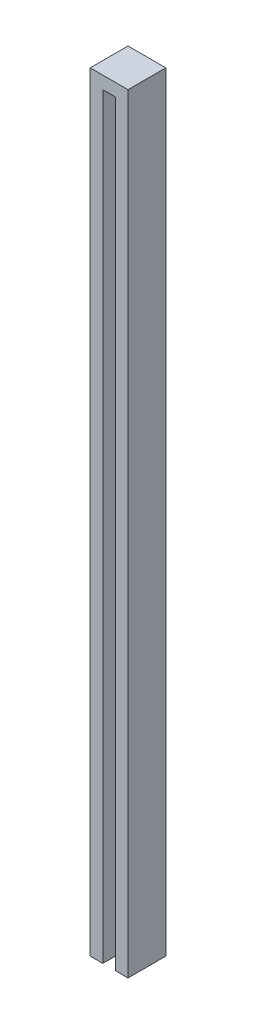
ISO-10303-21;
HEADER;
FILE_DESCRIPTION(('STEP AP214'),'2;1');
FILE_NAME('part.step','',(''),(''),'','','');
FILE_SCHEMA(('AUTOMOTIVE_DESIGN { 1 0 10303 214 1 1 1 1 }'));
ENDSEC;
DATA;
#1=APPLICATION_CONTEXT('core data for automotive mechanical design processes');
#2=APPLICATION_PROTOCOL_DEFINITION('international standard','automotive_design',2000,#1);
#3=PRODUCT_CONTEXT('',#1,'mechanical');
#4=PRODUCT('Part','Part','',(#3));
#5=PRODUCT_RELATED_PRODUCT_CATEGORY('part','',(#4));
#6=PRODUCT_DEFINITION_FORMATION('','',#4);
#7=PRODUCT_DEFINITION_CONTEXT('part definition',#1,'design');
#8=PRODUCT_DEFINITION('design','',#6,#7);
#9=PRODUCT_DEFINITION_SHAPE('','',#8);
#10=(LENGTH_UNIT() NAMED_UNIT(*) SI_UNIT(.MILLI.,.METRE.));
#11=(NAMED_UNIT(*) PLANE_ANGLE_UNIT() SI_UNIT($,.RADIAN.));
#12=(NAMED_UNIT(*) SI_UNIT($,.STERADIAN.) SOLID_ANGLE_UNIT());
#13=UNCERTAINTY_MEASURE_WITH_UNIT(LENGTH_MEASURE(1.E-05),#10,'distance_accuracy_value','');
#14=(GEOMETRIC_REPRESENTATION_CONTEXT(3) GLOBAL_UNCERTAINTY_ASSIGNED_CONTEXT((#13)) GLOBAL_UNIT_ASSIGNED_CONTEXT((#10,
#11,#12)) REPRESENTATION_CONTEXT('',''));
#15=CARTESIAN_POINT('',(0.,0.,0.));
#16=DIRECTION('',(0.,0.,1.));
#17=DIRECTION('',(1.,0.,0.));
#18=AXIS2_PLACEMENT_3D('',#15,#16,#17);
#19=CARTESIAN_POINT('',(75.,3050.,-75.));
#20=DIRECTION('',(-1.,0.,0.));
#21=DIRECTION('',(0.,0.,1.));
#22=AXIS2_PLACEMENT_3D('',#19,#20,#21);
#23=PLANE('',#22);
#24=DIRECTION('',(0.,0.,-1.));
#25=VECTOR('',#24,1.);
#26=CARTESIAN_POINT('',(75.,0.,-75.));
#27=LINE('',#26,#25);
#28=CARTESIAN_POINT('',(75.,0.,75.));
#29=VERTEX_POINT('',#28);
#30=CARTESIAN_POINT('',(75.,0.,-75.));
#31=VERTEX_POINT('',#30);
#32=EDGE_CURVE('E159',#29,#31,#27,.T.);
#33=ORIENTED_EDGE('',*,*,#32,.T.);
#34=DIRECTION('',(0.,-1.,0.));
#35=VECTOR('',#34,1.);
#36=CARTESIAN_POINT('',(75.,3050.,-75.));
#37=LINE('',#36,#35);
#38=CARTESIAN_POINT('',(75.,3050.,-75.));
#39=VERTEX_POINT('',#38);
#40=EDGE_CURVE('E11',#39,#31,#37,.T.);
#41=ORIENTED_EDGE('',*,*,#40,.F.);
#42=DIRECTION('',(0.,0.,-1.));
#43=VECTOR('',#42,1.);
#44=CARTESIAN_POINT('',(75.,3050.,-75.));
#45=LINE('',#44,#43);
#46=CARTESIAN_POINT('',(75.,3050.,75.));
#47=VERTEX_POINT('',#46);
#48=EDGE_CURVE('E191',#47,#39,#45,.T.);
#49=ORIENTED_EDGE('',*,*,#48,.F.);
#50=DIRECTION('',(0.,-1.,0.));
#51=VECTOR('',#50,1.);
#52=CARTESIAN_POINT('',(75.,3050.,75.));
#53=LINE('',#52,#51);
#54=EDGE_CURVE('E201',#47,#29,#53,.T.);
#55=ORIENTED_EDGE('',*,*,#54,.T.);
#56=EDGE_LOOP('',(#33,#41,#49,#55));
#57=FACE_BOUND('',#56,.T.);
#58=ADVANCED_FACE('F35',(#57),#23,.F.);
#59=CARTESIAN_POINT('',(-75.,3050.,-75.));
#60=DIRECTION('',(0.,0.,1.));
#61=DIRECTION('',(1.,0.,0.));
#62=AXIS2_PLACEMENT_3D('',#59,#60,#61);
#63=PLANE('',#62);
#64=DIRECTION('',(1.,0.,0.));
#65=VECTOR('',#64,1.);
#66=CARTESIAN_POINT('',(-25.,3000.,-75.));
#67=LINE('',#66,#65);
#68=CARTESIAN_POINT('',(-25.,3000.,-75.));
#69=VERTEX_POINT('',#68);
#70=CARTESIAN_POINT('',(25.,3000.,-75.));
#71=VERTEX_POINT('',#70);
#72=EDGE_CURVE('E167',#69,#71,#67,.T.);
#73=ORIENTED_EDGE('',*,*,#72,.F.);
#74=DIRECTION('',(0.,-1.,0.));
#75=VECTOR('',#74,1.);
#76=CARTESIAN_POINT('',(-25.,3000.,-75.));
#77=LINE('',#76,#75);
#78=CARTESIAN_POINT('',(-25.,0.,-75.));
#79=VERTEX_POINT('',#78);
#80=EDGE_CURVE('E177',#69,#79,#77,.T.);
#81=ORIENTED_EDGE('',*,*,#80,.T.);
#82=DIRECTION('',(-1.,0.,0.));
#83=VECTOR('',#82,1.);
#84=CARTESIAN_POINT('',(-75.,0.,-75.));
#85=LINE('',#84,#83);
#86=CARTESIAN_POINT('',(-75.,0.,-75.));
#87=VERTEX_POINT('',#86);
#88=EDGE_CURVE('E204',#79,#87,#85,.T.);
#89=ORIENTED_EDGE('',*,*,#88,.T.);
#90=DIRECTION('',(0.,-1.,0.));
#91=VECTOR('',#90,1.);
#92=CARTESIAN_POINT('',(-75.,3050.,-75.));
#93=LINE('',#92,#91);
#94=CARTESIAN_POINT('',(-75.,3050.,-75.));
#95=VERTEX_POINT('',#94);
#96=EDGE_CURVE('E42',#95,#87,#93,.T.);
#97=ORIENTED_EDGE('',*,*,#96,.F.);
#98=DIRECTION('',(-1.,0.,0.));
#99=VECTOR('',#98,1.);
#100=CARTESIAN_POINT('',(-75.,3050.,-75.));
#101=LINE('',#100,#99);
#102=EDGE_CURVE('E194',#39,#95,#101,.T.);
#103=ORIENTED_EDGE('',*,*,#102,.F.);
#104=ORIENTED_EDGE('',*,*,#40,.T.);
#105=CARTESIAN_POINT('',(25.,0.,-75.));
#106=VERTEX_POINT('',#105);
#107=EDGE_CURVE('E205',#31,#106,#85,.T.);
#108=ORIENTED_EDGE('',*,*,#107,.T.);
#109=DIRECTION('',(0.,-1.,0.));
#110=VECTOR('',#109,1.);
#111=CARTESIAN_POINT('',(25.,3000.,-75.));
#112=LINE('',#111,#110);
#113=EDGE_CURVE('E57',#71,#106,#112,.T.);
#114=ORIENTED_EDGE('',*,*,#113,.F.);
#115=EDGE_LOOP('',(#73,#81,#89,#97,#103,#104,#108,#114));
#116=FACE_BOUND('',#115,.T.);
#117=ADVANCED_FACE('F239',(#116),#63,.F.);
#118=CARTESIAN_POINT('',(-75.,3050.,-75.));
#119=DIRECTION('',(1.,0.,0.));
#120=DIRECTION('',(0.,0.,-1.));
#121=AXIS2_PLACEMENT_3D('',#118,#119,#120);
#122=PLANE('',#121);
#123=DIRECTION('',(0.,0.,1.));
#124=VECTOR('',#123,1.);
#125=CARTESIAN_POINT('',(-75.,0.,-75.));
#126=LINE('',#125,#124);
#127=CARTESIAN_POINT('',(-75.,0.,75.));
#128=VERTEX_POINT('',#127);
#129=EDGE_CURVE('E208',#87,#128,#126,.T.);
#130=ORIENTED_EDGE('',*,*,#129,.T.);
#131=DIRECTION('',(0.,-1.,0.));
#132=VECTOR('',#131,1.);
#133=CARTESIAN_POINT('',(-75.,3050.,75.));
#134=LINE('',#133,#132);
#135=CARTESIAN_POINT('',(-75.,3050.,75.));
#136=VERTEX_POINT('',#135);
#137=EDGE_CURVE('E215',#136,#128,#134,.T.);
#138=ORIENTED_EDGE('',*,*,#137,.F.);
#139=DIRECTION('',(0.,0.,1.));
#140=VECTOR('',#139,1.);
#141=CARTESIAN_POINT('',(-75.,3050.,-75.));
#142=LINE('',#141,#140);
#143=EDGE_CURVE('E197',#95,#136,#142,.T.);
#144=ORIENTED_EDGE('',*,*,#143,.F.);
#145=ORIENTED_EDGE('',*,*,#96,.T.);
#146=EDGE_LOOP('',(#130,#138,#144,#145));
#147=FACE_BOUND('',#146,.T.);
#148=ADVANCED_FACE('F222',(#147),#122,.F.);
#149=CARTESIAN_POINT('',(-75.,3050.,75.));
#150=DIRECTION('',(0.,0.,-1.));
#151=DIRECTION('',(-1.,0.,0.));
#152=AXIS2_PLACEMENT_3D('',#149,#150,#151);
#153=PLANE('',#152);
#154=DIRECTION('',(1.,0.,0.));
#155=VECTOR('',#154,1.);
#156=CARTESIAN_POINT('',(-75.,0.,75.));
#157=LINE('',#156,#155);
#158=CARTESIAN_POINT('',(-25.,0.,75.));
#159=VERTEX_POINT('',#158);
#160=EDGE_CURVE('E195',#128,#159,#157,.T.);
#161=ORIENTED_EDGE('',*,*,#160,.T.);
#162=DIRECTION('',(0.,-1.,0.));
#163=VECTOR('',#162,1.);
#164=CARTESIAN_POINT('',(-25.,3000.,75.));
#165=LINE('',#164,#163);
#166=CARTESIAN_POINT('',(-25.,3000.,75.));
#167=VERTEX_POINT('',#166);
#168=EDGE_CURVE('E157',#167,#159,#165,.T.);
#169=ORIENTED_EDGE('',*,*,#168,.F.);
#170=DIRECTION('',(-1.,0.,0.));
#171=VECTOR('',#170,1.);
#172=CARTESIAN_POINT('',(-25.,3000.,75.));
#173=LINE('',#172,#171);
#174=CARTESIAN_POINT('',(25.,3000.,75.));
#175=VERTEX_POINT('',#174);
#176=EDGE_CURVE('E131',#175,#167,#173,.T.);
#177=ORIENTED_EDGE('',*,*,#176,.F.);
#178=DIRECTION('',(0.,-1.,0.));
#179=VECTOR('',#178,1.);
#180=CARTESIAN_POINT('',(25.,3000.,75.));
#181=LINE('',#180,#179);
#182=CARTESIAN_POINT('',(25.,0.,75.));
#183=VERTEX_POINT('',#182);
#184=EDGE_CURVE('E160',#175,#183,#181,.T.);
#185=ORIENTED_EDGE('',*,*,#184,.T.);
#186=EDGE_CURVE('E210',#183,#29,#157,.T.);
#187=ORIENTED_EDGE('',*,*,#186,.T.);
#188=ORIENTED_EDGE('',*,*,#54,.F.);
#189=DIRECTION('',(1.,0.,0.));
#190=VECTOR('',#189,1.);
#191=CARTESIAN_POINT('',(-75.,3050.,75.));
#192=LINE('',#191,#190);
#193=EDGE_CURVE('E199',#136,#47,#192,.T.);
#194=ORIENTED_EDGE('',*,*,#193,.F.);
#195=ORIENTED_EDGE('',*,*,#137,.T.);
#196=EDGE_LOOP('',(#161,#169,#177,#185,#187,#188,#194,#195));
#197=FACE_BOUND('',#196,.T.);
#198=ADVANCED_FACE('F231',(#197),#153,.F.);
#199=CARTESIAN_POINT('',(0.,3050.,0.));
#200=DIRECTION('',(0.,1.,0.));
#201=DIRECTION('',(0.,0.,1.));
#202=AXIS2_PLACEMENT_3D('',#199,#200,#201);
#203=PLANE('',#202);
#204=ORIENTED_EDGE('',*,*,#48,.T.);
#205=ORIENTED_EDGE('',*,*,#102,.T.);
#206=ORIENTED_EDGE('',*,*,#143,.T.);
#207=ORIENTED_EDGE('',*,*,#193,.T.);
#208=EDGE_LOOP('',(#204,#205,#206,#207));
#209=FACE_BOUND('',#208,.T.);
#210=ADVANCED_FACE('F236',(#209),#203,.T.);
#211=CARTESIAN_POINT('',(0.,0.,0.));
#212=DIRECTION('',(0.,1.,0.));
#213=DIRECTION('',(0.,0.,1.));
#214=AXIS2_PLACEMENT_3D('',#211,#212,#213);
#215=PLANE('',#214);
#216=CARTESIAN_POINT('',(-50.,0.,-50.));
#217=DIRECTION('',(0.,-1.,0.));
#218=DIRECTION('',(0.,0.,1.));
#219=AXIS2_PLACEMENT_3D('',#216,#217,#218);
#220=CIRCLE('',#219,10.);
#221=CARTESIAN_POINT('',(-50.,0.,-40.));
#222=VERTEX_POINT('',#221);
#223=EDGE_CURVE('E451',#222,#222,#220,.T.);
#224=ORIENTED_EDGE('',*,*,#223,.F.);
#225=EDGE_LOOP('',(#224));
#226=FACE_BOUND('',#225,.T.);
#227=CARTESIAN_POINT('',(50.,0.,-50.));
#228=DIRECTION('',(0.,-1.,0.));
#229=DIRECTION('',(0.,0.,-1.));
#230=AXIS2_PLACEMENT_3D('',#227,#228,#229);
#231=CIRCLE('',#230,10.);
#232=CARTESIAN_POINT('',(50.,0.,-60.));
#233=VERTEX_POINT('',#232);
#234=EDGE_CURVE('E450',#233,#233,#231,.T.);
#235=ORIENTED_EDGE('',*,*,#234,.F.);
#236=EDGE_LOOP('',(#235));
#237=FACE_BOUND('',#236,.T.);
#238=CARTESIAN_POINT('',(50.,0.,50.));
#239=DIRECTION('',(0.,-1.,0.));
#240=DIRECTION('',(0.,0.,1.));
#241=AXIS2_PLACEMENT_3D('',#238,#239,#240);
#242=CIRCLE('',#241,10.);
#243=CARTESIAN_POINT('',(50.,0.,60.));
#244=VERTEX_POINT('',#243);
#245=EDGE_CURVE('E466',#244,#244,#242,.T.);
#246=ORIENTED_EDGE('',*,*,#245,.F.);
#247=EDGE_LOOP('',(#246));
#248=FACE_BOUND('',#247,.T.);
#249=CARTESIAN_POINT('',(-50.,0.,50.));
#250=DIRECTION('',(0.,-1.,0.));
#251=DIRECTION('',(0.,0.,-1.));
#252=AXIS2_PLACEMENT_3D('',#249,#250,#251);
#253=CIRCLE('',#252,10.);
#254=CARTESIAN_POINT('',(-50.,0.,40.));
#255=VERTEX_POINT('',#254);
#256=EDGE_CURVE('E149',#255,#255,#253,.T.);
#257=ORIENTED_EDGE('',*,*,#256,.F.);
#258=EDGE_LOOP('',(#257));
#259=FACE_BOUND('',#258,.T.);
#260=DIRECTION('',(1.,0.,0.));
#261=VECTOR('',#260,1.);
#262=CARTESIAN_POINT('',(-25.,0.,25.));
#263=LINE('',#262,#261);
#264=CARTESIAN_POINT('',(-25.,0.,25.));
#265=VERTEX_POINT('',#264);
#266=CARTESIAN_POINT('',(25.,0.,25.));
#267=VERTEX_POINT('',#266);
#268=EDGE_CURVE('E146',#265,#267,#263,.T.);
#269=ORIENTED_EDGE('',*,*,#268,.F.);
#270=DIRECTION('',(0.,0.,-1.));
#271=VECTOR('',#270,1.);
#272=CARTESIAN_POINT('',(-25.,0.,75.));
#273=LINE('',#272,#271);
#274=EDGE_CURVE('E49',#159,#265,#273,.T.);
#275=ORIENTED_EDGE('',*,*,#274,.F.);
#276=ORIENTED_EDGE('',*,*,#160,.F.);
#277=ORIENTED_EDGE('',*,*,#129,.F.);
#278=ORIENTED_EDGE('',*,*,#88,.F.);
#279=DIRECTION('',(0.,0.,-1.));
#280=VECTOR('',#279,1.);
#281=CARTESIAN_POINT('',(-25.,0.,-75.));
#282=LINE('',#281,#280);
#283=CARTESIAN_POINT('',(-25.,0.,-25.));
#284=VERTEX_POINT('',#283);
#285=EDGE_CURVE('E178',#284,#79,#282,.T.);
#286=ORIENTED_EDGE('',*,*,#285,.F.);
#287=DIRECTION('',(-1.,0.,0.));
#288=VECTOR('',#287,1.);
#289=CARTESIAN_POINT('',(-25.,0.,-25.));
#290=LINE('',#289,#288);
#291=CARTESIAN_POINT('',(25.,0.,-25.));
#292=VERTEX_POINT('',#291);
#293=EDGE_CURVE('E168',#292,#284,#290,.T.);
#294=ORIENTED_EDGE('',*,*,#293,.F.);
#295=DIRECTION('',(0.,0.,1.));
#296=VECTOR('',#295,1.);
#297=CARTESIAN_POINT('',(25.,0.,-75.));
#298=LINE('',#297,#296);
#299=EDGE_CURVE('E180',#106,#292,#298,.T.);
#300=ORIENTED_EDGE('',*,*,#299,.F.);
#301=ORIENTED_EDGE('',*,*,#107,.F.);
#302=ORIENTED_EDGE('',*,*,#32,.F.);
#303=ORIENTED_EDGE('',*,*,#186,.F.);
#304=DIRECTION('',(0.,0.,1.));
#305=VECTOR('',#304,1.);
#306=CARTESIAN_POINT('',(25.,0.,75.));
#307=LINE('',#306,#305);
#308=EDGE_CURVE('E144',#267,#183,#307,.T.);
#309=ORIENTED_EDGE('',*,*,#308,.F.);
#310=EDGE_LOOP('',(#269,#275,#276,#277,#278,#286,#294,#300,#301,#302,#303,#309));
#311=FACE_BOUND('',#310,.T.);
#312=ADVANCED_FACE('F228',(#226,#237,#248,#259,#311),#215,.F.);
#313=CARTESIAN_POINT('',(-25.,3000.,-75.));
#314=DIRECTION('',(-1.,0.,0.));
#315=DIRECTION('',(0.,0.,1.));
#316=AXIS2_PLACEMENT_3D('',#313,#314,#315);
#317=PLANE('',#316);
#318=ORIENTED_EDGE('',*,*,#285,.T.);
#319=ORIENTED_EDGE('',*,*,#80,.F.);
#320=DIRECTION('',(0.,0.,-1.));
#321=VECTOR('',#320,1.);
#322=CARTESIAN_POINT('',(-25.,3000.,-75.));
#323=LINE('',#322,#321);
#324=CARTESIAN_POINT('',(-25.,3000.,-25.));
#325=VERTEX_POINT('',#324);
#326=EDGE_CURVE('E164',#325,#69,#323,.T.);
#327=ORIENTED_EDGE('',*,*,#326,.F.);
#328=DIRECTION('',(0.,-1.,0.));
#329=VECTOR('',#328,1.);
#330=CARTESIAN_POINT('',(-25.,3000.,-25.));
#331=LINE('',#330,#329);
#332=EDGE_CURVE('E155',#325,#284,#331,.T.);
#333=ORIENTED_EDGE('',*,*,#332,.T.);
#334=EDGE_LOOP('',(#318,#319,#327,#333));
#335=FACE_BOUND('',#334,.T.);
#336=ADVANCED_FACE('F253',(#335),#317,.F.);
#337=CARTESIAN_POINT('',(-25.,3000.,-25.));
#338=DIRECTION('',(0.,0.,1.));
#339=DIRECTION('',(1.,0.,0.));
#340=AXIS2_PLACEMENT_3D('',#337,#338,#339);
#341=PLANE('',#340);
#342=ORIENTED_EDGE('',*,*,#293,.T.);
#343=ORIENTED_EDGE('',*,*,#332,.F.);
#344=DIRECTION('',(-1.,0.,0.));
#345=VECTOR('',#344,1.);
#346=CARTESIAN_POINT('',(-25.,3000.,-25.));
#347=LINE('',#346,#345);
#348=CARTESIAN_POINT('',(25.,3000.,-25.));
#349=VERTEX_POINT('',#348);
#350=EDGE_CURVE('E174',#349,#325,#347,.T.);
#351=ORIENTED_EDGE('',*,*,#350,.F.);
#352=DIRECTION('',(0.,-1.,0.));
#353=VECTOR('',#352,1.);
#354=CARTESIAN_POINT('',(25.,3000.,-25.));
#355=LINE('',#354,#353);
#356=EDGE_CURVE('E186',#349,#292,#355,.T.);
#357=ORIENTED_EDGE('',*,*,#356,.T.);
#358=EDGE_LOOP('',(#342,#343,#351,#357));
#359=FACE_BOUND('',#358,.T.);
#360=ADVANCED_FACE('F250',(#359),#341,.F.);
#361=CARTESIAN_POINT('',(25.,3000.,-75.));
#362=DIRECTION('',(1.,0.,0.));
#363=DIRECTION('',(0.,0.,-1.));
#364=AXIS2_PLACEMENT_3D('',#361,#362,#363);
#365=PLANE('',#364);
#366=ORIENTED_EDGE('',*,*,#299,.T.);
#367=ORIENTED_EDGE('',*,*,#356,.F.);
#368=DIRECTION('',(0.,0.,1.));
#369=VECTOR('',#368,1.);
#370=CARTESIAN_POINT('',(25.,3000.,-75.));
#371=LINE('',#370,#369);
#372=EDGE_CURVE('E171',#71,#349,#371,.T.);
#373=ORIENTED_EDGE('',*,*,#372,.F.);
#374=ORIENTED_EDGE('',*,*,#113,.T.);
#375=EDGE_LOOP('',(#366,#367,#373,#374));
#376=FACE_BOUND('',#375,.T.);
#377=ADVANCED_FACE('F245',(#376),#365,.F.);
#378=CARTESIAN_POINT('',(0.,3000.,0.));
#379=DIRECTION('',(0.,1.,0.));
#380=DIRECTION('',(0.,0.,1.));
#381=AXIS2_PLACEMENT_3D('',#378,#379,#380);
#382=PLANE('',#381);
#383=ORIENTED_EDGE('',*,*,#326,.T.);
#384=ORIENTED_EDGE('',*,*,#72,.T.);
#385=ORIENTED_EDGE('',*,*,#372,.T.);
#386=ORIENTED_EDGE('',*,*,#350,.T.);
#387=EDGE_LOOP('',(#383,#384,#385,#386));
#388=FACE_BOUND('',#387,.T.);
#389=ADVANCED_FACE('F249',(#388),#382,.F.);
#390=CARTESIAN_POINT('',(-25.,3000.,75.));
#391=DIRECTION('',(-1.,0.,0.));
#392=DIRECTION('',(0.,0.,1.));
#393=AXIS2_PLACEMENT_3D('',#390,#391,#392);
#394=PLANE('',#393);
#395=ORIENTED_EDGE('',*,*,#274,.T.);
#396=DIRECTION('',(0.,-1.,0.));
#397=VECTOR('',#396,1.);
#398=CARTESIAN_POINT('',(-25.,3000.,25.));
#399=LINE('',#398,#397);
#400=CARTESIAN_POINT('',(-25.,3000.,25.));
#401=VERTEX_POINT('',#400);
#402=EDGE_CURVE('E121',#401,#265,#399,.T.);
#403=ORIENTED_EDGE('',*,*,#402,.F.);
#404=DIRECTION('',(0.,0.,-1.));
#405=VECTOR('',#404,1.);
#406=CARTESIAN_POINT('',(-25.,3000.,75.));
#407=LINE('',#406,#405);
#408=EDGE_CURVE('E125',#167,#401,#407,.T.);
#409=ORIENTED_EDGE('',*,*,#408,.F.);
#410=ORIENTED_EDGE('',*,*,#168,.T.);
#411=EDGE_LOOP('',(#395,#403,#409,#410));
#412=FACE_BOUND('',#411,.T.);
#413=ADVANCED_FACE('F123',(#412),#394,.F.);
#414=CARTESIAN_POINT('',(25.,3000.,75.));
#415=DIRECTION('',(1.,0.,0.));
#416=DIRECTION('',(0.,0.,-1.));
#417=AXIS2_PLACEMENT_3D('',#414,#415,#416);
#418=PLANE('',#417);
#419=ORIENTED_EDGE('',*,*,#308,.T.);
#420=ORIENTED_EDGE('',*,*,#184,.F.);
#421=DIRECTION('',(0.,0.,1.));
#422=VECTOR('',#421,1.);
#423=CARTESIAN_POINT('',(25.,3000.,75.));
#424=LINE('',#423,#422);
#425=CARTESIAN_POINT('',(25.,3000.,25.));
#426=VERTEX_POINT('',#425);
#427=EDGE_CURVE('E139',#426,#175,#424,.T.);
#428=ORIENTED_EDGE('',*,*,#427,.F.);
#429=DIRECTION('',(0.,-1.,0.));
#430=VECTOR('',#429,1.);
#431=CARTESIAN_POINT('',(25.,3000.,25.));
#432=LINE('',#431,#430);
#433=EDGE_CURVE('E130',#426,#267,#432,.T.);
#434=ORIENTED_EDGE('',*,*,#433,.T.);
#435=EDGE_LOOP('',(#419,#420,#428,#434));
#436=FACE_BOUND('',#435,.T.);
#437=ADVANCED_FACE('F378',(#436),#418,.F.);
#438=CARTESIAN_POINT('',(-25.,3000.,25.));
#439=DIRECTION('',(0.,0.,-1.));
#440=DIRECTION('',(-1.,0.,0.));
#441=AXIS2_PLACEMENT_3D('',#438,#439,#440);
#442=PLANE('',#441);
#443=ORIENTED_EDGE('',*,*,#268,.T.);
#444=ORIENTED_EDGE('',*,*,#433,.F.);
#445=DIRECTION('',(1.,0.,0.));
#446=VECTOR('',#445,1.);
#447=CARTESIAN_POINT('',(-25.,3000.,25.));
#448=LINE('',#447,#446);
#449=EDGE_CURVE('E134',#401,#426,#448,.T.);
#450=ORIENTED_EDGE('',*,*,#449,.F.);
#451=ORIENTED_EDGE('',*,*,#402,.T.);
#452=EDGE_LOOP('',(#443,#444,#450,#451));
#453=FACE_BOUND('',#452,.T.);
#454=ADVANCED_FACE('F135',(#453),#442,.F.);
#455=CARTESIAN_POINT('',(0.,3000.,0.));
#456=DIRECTION('',(0.,-1.,0.));
#457=DIRECTION('',(0.,0.,-1.));
#458=AXIS2_PLACEMENT_3D('',#455,#456,#457);
#459=PLANE('',#458);
#460=ORIENTED_EDGE('',*,*,#408,.T.);
#461=ORIENTED_EDGE('',*,*,#449,.T.);
#462=ORIENTED_EDGE('',*,*,#427,.T.);
#463=ORIENTED_EDGE('',*,*,#176,.T.);
#464=EDGE_LOOP('',(#460,#461,#462,#463));
#465=FACE_BOUND('',#464,.T.);
#466=ADVANCED_FACE('F141',(#465),#459,.T.);
#467=CARTESIAN_POINT('',(-50.,10.,50.));
#468=DIRECTION('',(0.,-1.,0.));
#469=DIRECTION('',(0.,0.,-1.));
#470=AXIS2_PLACEMENT_3D('',#467,#468,#469);
#471=CYLINDRICAL_SURFACE('',#470,10.);
#472=CARTESIAN_POINT('',(-50.,10.,50.));
#473=DIRECTION('',(0.,-1.,0.));
#474=DIRECTION('',(0.,0.,-1.));
#475=AXIS2_PLACEMENT_3D('',#472,#473,#474);
#476=CIRCLE('',#475,10.);
#477=CARTESIAN_POINT('',(-50.,10.,40.));
#478=VERTEX_POINT('',#477);
#479=EDGE_CURVE('E181',#478,#478,#476,.T.);
#480=ORIENTED_EDGE('',*,*,#479,.F.);
#481=EDGE_LOOP('',(#480));
#482=FACE_BOUND('',#481,.T.);
#483=ORIENTED_EDGE('',*,*,#256,.T.);
#484=EDGE_LOOP('',(#483));
#485=FACE_BOUND('',#484,.T.);
#486=ADVANCED_FACE('F296',(#482,#485),#471,.F.);
#487=CARTESIAN_POINT('',(-50.,10.,50.));
#488=DIRECTION('',(0.,-1.,0.));
#489=DIRECTION('',(0.,0.,-1.));
#490=AXIS2_PLACEMENT_3D('',#487,#488,#489);
#491=PLANE('',#490);
#492=ORIENTED_EDGE('',*,*,#479,.T.);
#493=EDGE_LOOP('',(#492));
#494=FACE_BOUND('',#493,.T.);
#495=ADVANCED_FACE('F301',(#494),#491,.T.);
#496=CARTESIAN_POINT('',(50.,10.,50.));
#497=DIRECTION('',(0.,-1.,0.));
#498=DIRECTION('',(0.,0.,-1.));
#499=AXIS2_PLACEMENT_3D('',#496,#497,#498);
#500=CYLINDRICAL_SURFACE('',#499,10.);
#501=CARTESIAN_POINT('',(50.,10.,50.));
#502=DIRECTION('',(0.,-1.,0.));
#503=DIRECTION('',(0.,0.,1.));
#504=AXIS2_PLACEMENT_3D('',#501,#502,#503);
#505=CIRCLE('',#504,10.);
#506=CARTESIAN_POINT('',(50.,10.,60.));
#507=VERTEX_POINT('',#506);
#508=EDGE_CURVE('E462',#507,#507,#505,.T.);
#509=ORIENTED_EDGE('',*,*,#508,.F.);
#510=EDGE_LOOP('',(#509));
#511=FACE_BOUND('',#510,.T.);
#512=ORIENTED_EDGE('',*,*,#245,.T.);
#513=EDGE_LOOP('',(#512));
#514=FACE_BOUND('',#513,.T.);
#515=ADVANCED_FACE('F311',(#511,#514),#500,.F.);
#516=CARTESIAN_POINT('',(50.,10.,50.));
#517=DIRECTION('',(0.,1.,0.));
#518=DIRECTION('',(0.,0.,1.));
#519=AXIS2_PLACEMENT_3D('',#516,#517,#518);
#520=PLANE('',#519);
#521=ORIENTED_EDGE('',*,*,#508,.T.);
#522=EDGE_LOOP('',(#521));
#523=FACE_BOUND('',#522,.T.);
#524=ADVANCED_FACE('F321',(#523),#520,.F.);
#525=CARTESIAN_POINT('',(50.,10.,-50.));
#526=DIRECTION('',(0.,-1.,0.));
#527=DIRECTION('',(0.,0.,-1.));
#528=AXIS2_PLACEMENT_3D('',#525,#526,#527);
#529=CYLINDRICAL_SURFACE('',#528,10.);
#530=CARTESIAN_POINT('',(50.,10.,-50.));
#531=DIRECTION('',(0.,-1.,0.));
#532=DIRECTION('',(0.,0.,-1.));
#533=AXIS2_PLACEMENT_3D('',#530,#531,#532);
#534=CIRCLE('',#533,10.);
#535=CARTESIAN_POINT('',(50.,10.,-60.));
#536=VERTEX_POINT('',#535);
#537=EDGE_CURVE('E454',#536,#536,#534,.T.);
#538=ORIENTED_EDGE('',*,*,#537,.F.);
#539=EDGE_LOOP('',(#538));
#540=FACE_BOUND('',#539,.T.);
#541=ORIENTED_EDGE('',*,*,#234,.T.);
#542=EDGE_LOOP('',(#541));
#543=FACE_BOUND('',#542,.T.);
#544=ADVANCED_FACE('F331',(#540,#543),#529,.F.);
#545=CARTESIAN_POINT('',(50.,10.,-50.));
#546=DIRECTION('',(0.,-1.,0.));
#547=DIRECTION('',(0.,0.,-1.));
#548=AXIS2_PLACEMENT_3D('',#545,#546,#547);
#549=PLANE('',#548);
#550=ORIENTED_EDGE('',*,*,#537,.T.);
#551=EDGE_LOOP('',(#550));
#552=FACE_BOUND('',#551,.T.);
#553=ADVANCED_FACE('F341',(#552),#549,.T.);
#554=CARTESIAN_POINT('',(-50.,10.,-50.));
#555=DIRECTION('',(0.,-1.,0.));
#556=DIRECTION('',(0.,0.,-1.));
#557=AXIS2_PLACEMENT_3D('',#554,#555,#556);
#558=CYLINDRICAL_SURFACE('',#557,10.);
#559=CARTESIAN_POINT('',(-50.,10.,-50.));
#560=DIRECTION('',(0.,-1.,0.));
#561=DIRECTION('',(0.,0.,1.));
#562=AXIS2_PLACEMENT_3D('',#559,#560,#561);
#563=CIRCLE('',#562,10.);
#564=CARTESIAN_POINT('',(-50.,10.,-40.));
#565=VERTEX_POINT('',#564);
#566=EDGE_CURVE('E449',#565,#565,#563,.T.);
#567=ORIENTED_EDGE('',*,*,#566,.F.);
#568=EDGE_LOOP('',(#567));
#569=FACE_BOUND('',#568,.T.);
#570=ORIENTED_EDGE('',*,*,#223,.T.);
#571=EDGE_LOOP('',(#570));
#572=FACE_BOUND('',#571,.T.);
#573=ADVANCED_FACE('F351',(#569,#572),#558,.F.);
#574=CARTESIAN_POINT('',(-50.,10.,-50.));
#575=DIRECTION('',(0.,1.,0.));
#576=DIRECTION('',(0.,0.,1.));
#577=AXIS2_PLACEMENT_3D('',#574,#575,#576);
#578=PLANE('',#577);
#579=ORIENTED_EDGE('',*,*,#566,.T.);
#580=EDGE_LOOP('',(#579));
#581=FACE_BOUND('',#580,.T.);
#582=ADVANCED_FACE('F361',(#581),#578,.F.);
#583=CLOSED_SHELL('',(#58,#117,#148,#198,#210,#312,#336,#360,#377,#389,#413,#437,#454,#466,#486,
#495,#515,#524,#544,#553,#573,#582));
#584=MANIFOLD_SOLID_BREP('B2',#583);
#585=ADVANCED_BREP_SHAPE_REPRESENTATION('',(#18,#584),#14);
#586=SHAPE_DEFINITION_REPRESENTATION(#9,#585);
ENDSEC;
END-ISO-10303-21;
